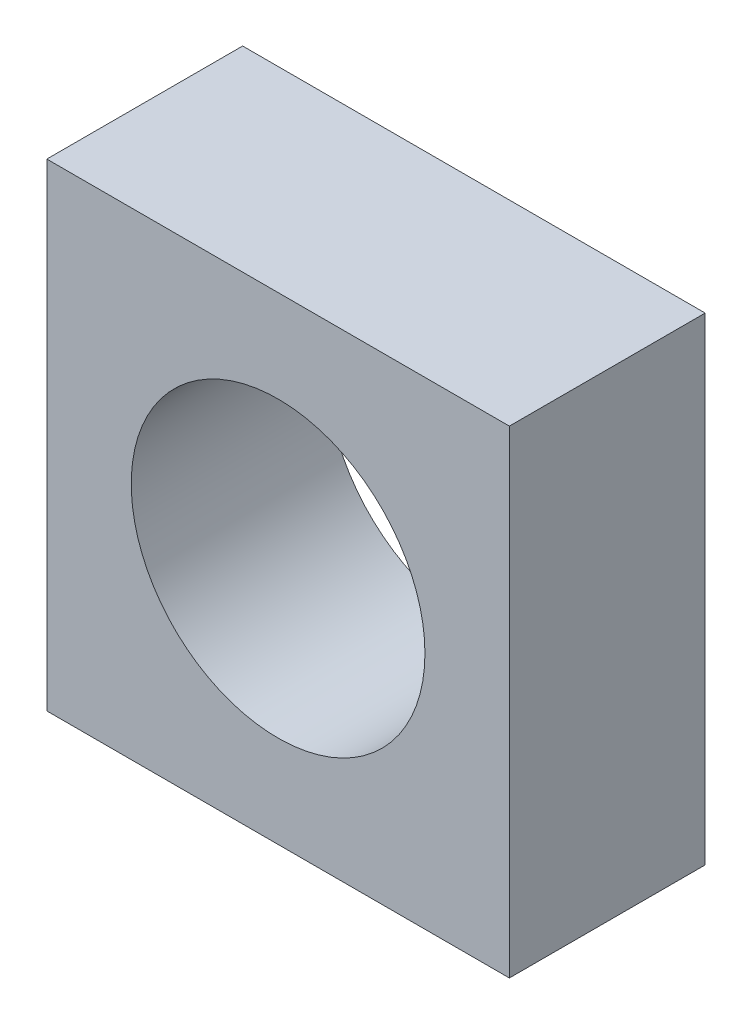
ISO-10303-21;
HEADER;
FILE_DESCRIPTION(('STEP AP214'),'2;1');
FILE_NAME('part.step','',(''),(''),'','','');
FILE_SCHEMA(('AUTOMOTIVE_DESIGN { 1 0 10303 214 1 1 1 1 }'));
ENDSEC;
DATA;
#1=APPLICATION_CONTEXT('core data for automotive mechanical design processes');
#2=APPLICATION_PROTOCOL_DEFINITION('international standard','automotive_design',2000,#1);
#3=PRODUCT_CONTEXT('',#1,'mechanical');
#4=PRODUCT('Part','Part','',(#3));
#5=PRODUCT_RELATED_PRODUCT_CATEGORY('part','',(#4));
#6=PRODUCT_DEFINITION_FORMATION('','',#4);
#7=PRODUCT_DEFINITION_CONTEXT('part definition',#1,'design');
#8=PRODUCT_DEFINITION('design','',#6,#7);
#9=PRODUCT_DEFINITION_SHAPE('','',#8);
#10=(LENGTH_UNIT() NAMED_UNIT(*) SI_UNIT(.MILLI.,.METRE.));
#11=(NAMED_UNIT(*) PLANE_ANGLE_UNIT() SI_UNIT($,.RADIAN.));
#12=(NAMED_UNIT(*) SI_UNIT($,.STERADIAN.) SOLID_ANGLE_UNIT());
#13=UNCERTAINTY_MEASURE_WITH_UNIT(LENGTH_MEASURE(1.E-05),#10,'distance_accuracy_value','');
#14=(GEOMETRIC_REPRESENTATION_CONTEXT(3) GLOBAL_UNCERTAINTY_ASSIGNED_CONTEXT((#13)) GLOBAL_UNIT_ASSIGNED_CONTEXT((#10,
#11,#12)) REPRESENTATION_CONTEXT('',''));
#15=CARTESIAN_POINT('',(0.,0.,0.));
#16=DIRECTION('',(0.,0.,1.));
#17=DIRECTION('',(1.,0.,0.));
#18=AXIS2_PLACEMENT_3D('',#15,#16,#17);
#19=CARTESIAN_POINT('',(0.,0.,25.4));
#20=DIRECTION('',(0.,0.,1.));
#21=DIRECTION('',(1.,0.,0.));
#22=AXIS2_PLACEMENT_3D('',#19,#20,#21);
#23=PLANE('',#22);
#24=DIRECTION('',(0.,-1.,0.));
#25=VECTOR('',#24,1.);
#26=CARTESIAN_POINT('',(-30.,-31.,25.4));
#27=LINE('',#26,#25);
#28=CARTESIAN_POINT('',(-30.,31.,25.4));
#29=VERTEX_POINT('',#28);
#30=CARTESIAN_POINT('',(-30.,-31.,25.4));
#31=VERTEX_POINT('',#30);
#32=EDGE_CURVE('E84',#29,#31,#27,.T.);
#33=ORIENTED_EDGE('',*,*,#32,.T.);
#34=DIRECTION('',(1.,0.,0.));
#35=VECTOR('',#34,1.);
#36=CARTESIAN_POINT('',(30.,-31.,25.4));
#37=LINE('',#36,#35);
#38=CARTESIAN_POINT('',(30.,-31.,25.4));
#39=VERTEX_POINT('',#38);
#40=EDGE_CURVE('E79',#31,#39,#37,.T.);
#41=ORIENTED_EDGE('',*,*,#40,.T.);
#42=DIRECTION('',(0.,1.,0.));
#43=VECTOR('',#42,1.);
#44=CARTESIAN_POINT('',(30.,-31.,25.4));
#45=LINE('',#44,#43);
#46=CARTESIAN_POINT('',(30.,31.,25.4));
#47=VERTEX_POINT('',#46);
#48=EDGE_CURVE('E82',#39,#47,#45,.T.);
#49=ORIENTED_EDGE('',*,*,#48,.T.);
#50=DIRECTION('',(-1.,0.,0.));
#51=VECTOR('',#50,1.);
#52=CARTESIAN_POINT('',(30.,31.,25.4));
#53=LINE('',#52,#51);
#54=EDGE_CURVE('E49',#47,#29,#53,.T.);
#55=ORIENTED_EDGE('',*,*,#54,.T.);
#56=EDGE_LOOP('',(#33,#41,#49,#55));
#57=FACE_BOUND('',#56,.T.);
#58=CARTESIAN_POINT('',(0.,0.,25.4));
#59=DIRECTION('',(0.,0.,1.));
#60=DIRECTION('',(1.,0.,0.));
#61=AXIS2_PLACEMENT_3D('',#58,#59,#60);
#62=CIRCLE('',#61,19.05);
#63=CARTESIAN_POINT('',(19.05,0.,25.4));
#64=VERTEX_POINT('',#63);
#65=EDGE_CURVE('E99',#64,#64,#62,.T.);
#66=ORIENTED_EDGE('',*,*,#65,.F.);
#67=EDGE_LOOP('',(#66));
#68=FACE_BOUND('',#67,.T.);
#69=ADVANCED_FACE('F32',(#57,#68),#23,.T.);
#70=CARTESIAN_POINT('',(0.,0.,0.));
#71=DIRECTION('',(0.,0.,1.));
#72=DIRECTION('',(1.,0.,0.));
#73=AXIS2_PLACEMENT_3D('',#70,#71,#72);
#74=PLANE('',#73);
#75=DIRECTION('',(0.,-1.,0.));
#76=VECTOR('',#75,1.);
#77=CARTESIAN_POINT('',(-30.,-31.,0.));
#78=LINE('',#77,#76);
#79=CARTESIAN_POINT('',(-30.,31.,0.));
#80=VERTEX_POINT('',#79);
#81=CARTESIAN_POINT('',(-30.,-31.,0.));
#82=VERTEX_POINT('',#81);
#83=EDGE_CURVE('E96',#80,#82,#78,.T.);
#84=ORIENTED_EDGE('',*,*,#83,.F.);
#85=DIRECTION('',(-1.,0.,0.));
#86=VECTOR('',#85,1.);
#87=CARTESIAN_POINT('',(30.,31.,0.));
#88=LINE('',#87,#86);
#89=CARTESIAN_POINT('',(30.,31.,0.));
#90=VERTEX_POINT('',#89);
#91=EDGE_CURVE('E72',#90,#80,#88,.T.);
#92=ORIENTED_EDGE('',*,*,#91,.F.);
#93=DIRECTION('',(0.,1.,0.));
#94=VECTOR('',#93,1.);
#95=CARTESIAN_POINT('',(30.,-31.,0.));
#96=LINE('',#95,#94);
#97=CARTESIAN_POINT('',(30.,-31.,0.));
#98=VERTEX_POINT('',#97);
#99=EDGE_CURVE('E66',#98,#90,#96,.T.);
#100=ORIENTED_EDGE('',*,*,#99,.F.);
#101=DIRECTION('',(1.,0.,0.));
#102=VECTOR('',#101,1.);
#103=CARTESIAN_POINT('',(30.,-31.,0.));
#104=LINE('',#103,#102);
#105=EDGE_CURVE('E88',#82,#98,#104,.T.);
#106=ORIENTED_EDGE('',*,*,#105,.F.);
#107=EDGE_LOOP('',(#84,#92,#100,#106));
#108=FACE_BOUND('',#107,.T.);
#109=CARTESIAN_POINT('',(0.,0.,0.));
#110=DIRECTION('',(0.,0.,1.));
#111=DIRECTION('',(1.,0.,0.));
#112=AXIS2_PLACEMENT_3D('',#109,#110,#111);
#113=CIRCLE('',#112,19.05);
#114=CARTESIAN_POINT('',(19.05,0.,0.));
#115=VERTEX_POINT('',#114);
#116=EDGE_CURVE('E111',#115,#115,#113,.T.);
#117=ORIENTED_EDGE('',*,*,#116,.T.);
#118=EDGE_LOOP('',(#117));
#119=FACE_BOUND('',#118,.T.);
#120=ADVANCED_FACE('F107',(#108,#119),#74,.F.);
#121=CARTESIAN_POINT('',(-30.,-31.,25.4));
#122=DIRECTION('',(1.,0.,0.));
#123=DIRECTION('',(0.,1.,0.));
#124=AXIS2_PLACEMENT_3D('',#121,#122,#123);
#125=PLANE('',#124);
#126=ORIENTED_EDGE('',*,*,#83,.T.);
#127=DIRECTION('',(0.,0.,-1.));
#128=VECTOR('',#127,1.);
#129=CARTESIAN_POINT('',(-30.,-31.,25.4));
#130=LINE('',#129,#128);
#131=EDGE_CURVE('E11',#31,#82,#130,.T.);
#132=ORIENTED_EDGE('',*,*,#131,.F.);
#133=ORIENTED_EDGE('',*,*,#32,.F.);
#134=DIRECTION('',(0.,0.,-1.));
#135=VECTOR('',#134,1.);
#136=CARTESIAN_POINT('',(-30.,31.,25.4));
#137=LINE('',#136,#135);
#138=EDGE_CURVE('E92',#29,#80,#137,.T.);
#139=ORIENTED_EDGE('',*,*,#138,.T.);
#140=EDGE_LOOP('',(#126,#132,#133,#139));
#141=FACE_BOUND('',#140,.T.);
#142=ADVANCED_FACE('F34',(#141),#125,.F.);
#143=CARTESIAN_POINT('',(30.,-31.,25.4));
#144=DIRECTION('',(0.,1.,0.));
#145=DIRECTION('',(-1.,0.,0.));
#146=AXIS2_PLACEMENT_3D('',#143,#144,#145);
#147=PLANE('',#146);
#148=ORIENTED_EDGE('',*,*,#105,.T.);
#149=DIRECTION('',(0.,0.,-1.));
#150=VECTOR('',#149,1.);
#151=CARTESIAN_POINT('',(30.,-31.,25.4));
#152=LINE('',#151,#150);
#153=EDGE_CURVE('E41',#39,#98,#152,.T.);
#154=ORIENTED_EDGE('',*,*,#153,.F.);
#155=ORIENTED_EDGE('',*,*,#40,.F.);
#156=ORIENTED_EDGE('',*,*,#131,.T.);
#157=EDGE_LOOP('',(#148,#154,#155,#156));
#158=FACE_BOUND('',#157,.T.);
#159=ADVANCED_FACE('F87',(#158),#147,.F.);
#160=CARTESIAN_POINT('',(30.,-31.,25.4));
#161=DIRECTION('',(-1.,0.,0.));
#162=DIRECTION('',(0.,0.,1.));
#163=AXIS2_PLACEMENT_3D('',#160,#161,#162);
#164=PLANE('',#163);
#165=ORIENTED_EDGE('',*,*,#99,.T.);
#166=DIRECTION('',(0.,0.,-1.));
#167=VECTOR('',#166,1.);
#168=CARTESIAN_POINT('',(30.,31.,25.4));
#169=LINE('',#168,#167);
#170=EDGE_CURVE('E89',#47,#90,#169,.T.);
#171=ORIENTED_EDGE('',*,*,#170,.F.);
#172=ORIENTED_EDGE('',*,*,#48,.F.);
#173=ORIENTED_EDGE('',*,*,#153,.T.);
#174=EDGE_LOOP('',(#165,#171,#172,#173));
#175=FACE_BOUND('',#174,.T.);
#176=ADVANCED_FACE('F90',(#175),#164,.F.);
#177=CARTESIAN_POINT('',(30.,31.,25.4));
#178=DIRECTION('',(0.,-1.,0.));
#179=DIRECTION('',(1.,0.,0.));
#180=AXIS2_PLACEMENT_3D('',#177,#178,#179);
#181=PLANE('',#180);
#182=ORIENTED_EDGE('',*,*,#91,.T.);
#183=ORIENTED_EDGE('',*,*,#138,.F.);
#184=ORIENTED_EDGE('',*,*,#54,.F.);
#185=ORIENTED_EDGE('',*,*,#170,.T.);
#186=EDGE_LOOP('',(#182,#183,#184,#185));
#187=FACE_BOUND('',#186,.T.);
#188=ADVANCED_FACE('F104',(#187),#181,.F.);
#189=CARTESIAN_POINT('',(0.,0.,25.4));
#190=DIRECTION('',(0.,0.,-1.));
#191=DIRECTION('',(-1.,0.,0.));
#192=AXIS2_PLACEMENT_3D('',#189,#190,#191);
#193=CYLINDRICAL_SURFACE('',#192,19.05);
#194=ORIENTED_EDGE('',*,*,#65,.T.);
#195=EDGE_LOOP('',(#194));
#196=FACE_BOUND('',#195,.T.);
#197=ORIENTED_EDGE('',*,*,#116,.F.);
#198=EDGE_LOOP('',(#197));
#199=FACE_BOUND('',#198,.T.);
#200=ADVANCED_FACE('F117',(#196,#199),#193,.F.);
#201=CLOSED_SHELL('',(#69,#120,#142,#159,#176,#188,#200));
#202=MANIFOLD_SOLID_BREP('B2',#201);
#203=ADVANCED_BREP_SHAPE_REPRESENTATION('',(#18,#202),#14);
#204=SHAPE_DEFINITION_REPRESENTATION(#9,#203);
ENDSEC;
END-ISO-10303-21;
